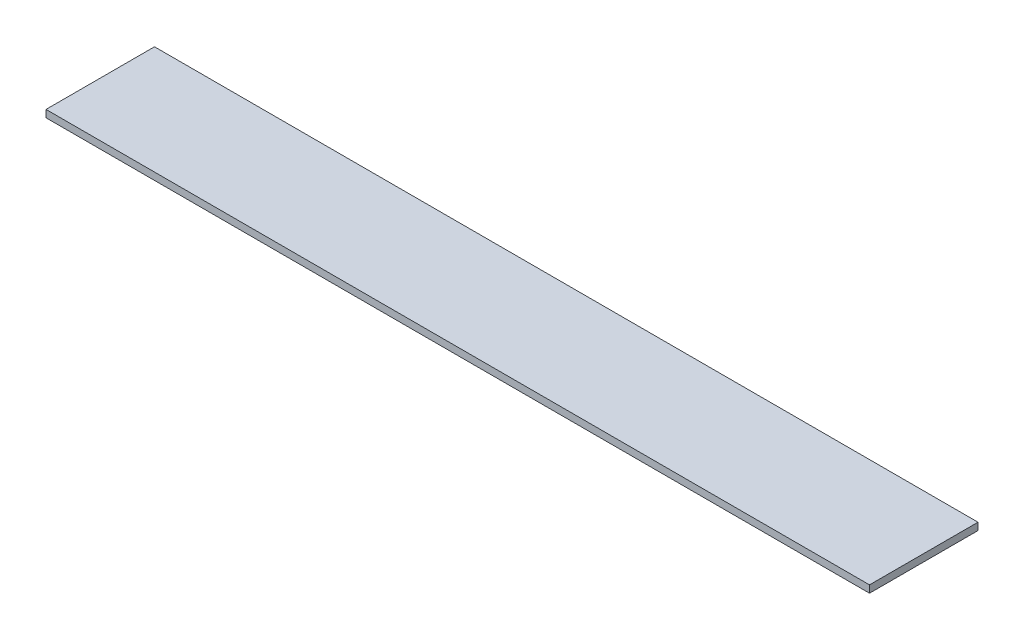
ISO-10303-21;
HEADER;
FILE_DESCRIPTION(('STEP AP214'),'2;1');
FILE_NAME('part.step','',(''),(''),'','','');
FILE_SCHEMA(('AUTOMOTIVE_DESIGN { 1 0 10303 214 1 1 1 1 }'));
ENDSEC;
DATA;
#1=APPLICATION_CONTEXT('core data for automotive mechanical design processes');
#2=APPLICATION_PROTOCOL_DEFINITION('international standard','automotive_design',2000,#1);
#3=PRODUCT_CONTEXT('',#1,'mechanical');
#4=PRODUCT('Part','Part','',(#3));
#5=PRODUCT_RELATED_PRODUCT_CATEGORY('part','',(#4));
#6=PRODUCT_DEFINITION_FORMATION('','',#4);
#7=PRODUCT_DEFINITION_CONTEXT('part definition',#1,'design');
#8=PRODUCT_DEFINITION('design','',#6,#7);
#9=PRODUCT_DEFINITION_SHAPE('','',#8);
#10=(LENGTH_UNIT() NAMED_UNIT(*) SI_UNIT(.MILLI.,.METRE.));
#11=(NAMED_UNIT(*) PLANE_ANGLE_UNIT() SI_UNIT($,.RADIAN.));
#12=(NAMED_UNIT(*) SI_UNIT($,.STERADIAN.) SOLID_ANGLE_UNIT());
#13=UNCERTAINTY_MEASURE_WITH_UNIT(LENGTH_MEASURE(1.E-05),#10,'distance_accuracy_value','');
#14=(GEOMETRIC_REPRESENTATION_CONTEXT(3) GLOBAL_UNCERTAINTY_ASSIGNED_CONTEXT((#13)) GLOBAL_UNIT_ASSIGNED_CONTEXT((#10,
#11,#12)) REPRESENTATION_CONTEXT('',''));
#15=CARTESIAN_POINT('',(0.,0.,0.));
#16=DIRECTION('',(0.,0.,1.));
#17=DIRECTION('',(1.,0.,0.));
#18=AXIS2_PLACEMENT_3D('',#15,#16,#17);
#19=CARTESIAN_POINT('',(0.,4.7625,0.));
#20=DIRECTION('',(1.,0.,0.));
#21=DIRECTION('',(0.,0.,-1.));
#22=AXIS2_PLACEMENT_3D('',#19,#20,#21);
#23=PLANE('',#22);
#24=DIRECTION('',(0.,0.,1.));
#25=VECTOR('',#24,1.);
#26=CARTESIAN_POINT('',(0.,0.,0.));
#27=LINE('',#26,#25);
#28=CARTESIAN_POINT('',(0.,0.,-71.12));
#29=VERTEX_POINT('',#28);
#30=CARTESIAN_POINT('',(0.,0.,0.));
#31=VERTEX_POINT('',#30);
#32=EDGE_CURVE('E98',#29,#31,#27,.T.);
#33=ORIENTED_EDGE('',*,*,#32,.T.);
#34=DIRECTION('',(0.,-1.,0.));
#35=VECTOR('',#34,1.);
#36=CARTESIAN_POINT('',(0.,4.7625,0.));
#37=LINE('',#36,#35);
#38=CARTESIAN_POINT('',(0.,4.7625,0.));
#39=VERTEX_POINT('',#38);
#40=EDGE_CURVE('E11',#39,#31,#37,.T.);
#41=ORIENTED_EDGE('',*,*,#40,.F.);
#42=DIRECTION('',(0.,0.,1.));
#43=VECTOR('',#42,1.);
#44=CARTESIAN_POINT('',(0.,4.7625,0.));
#45=LINE('',#44,#43);
#46=CARTESIAN_POINT('',(0.,4.7625,-71.12));
#47=VERTEX_POINT('',#46);
#48=EDGE_CURVE('E86',#47,#39,#45,.T.);
#49=ORIENTED_EDGE('',*,*,#48,.F.);
#50=DIRECTION('',(0.,-1.,0.));
#51=VECTOR('',#50,1.);
#52=CARTESIAN_POINT('',(0.,4.7625,-71.12));
#53=LINE('',#52,#51);
#54=EDGE_CURVE('E94',#47,#29,#53,.T.);
#55=ORIENTED_EDGE('',*,*,#54,.T.);
#56=EDGE_LOOP('',(#33,#41,#49,#55));
#57=FACE_BOUND('',#56,.T.);
#58=ADVANCED_FACE('F35',(#57),#23,.F.);
#59=CARTESIAN_POINT('',(0.,4.7625,0.));
#60=DIRECTION('',(0.,0.,-1.));
#61=DIRECTION('',(-1.,0.,0.));
#62=AXIS2_PLACEMENT_3D('',#59,#60,#61);
#63=PLANE('',#62);
#64=DIRECTION('',(1.,0.,0.));
#65=VECTOR('',#64,1.);
#66=CARTESIAN_POINT('',(0.,0.,0.));
#67=LINE('',#66,#65);
#68=CARTESIAN_POINT('',(539.75,0.,0.));
#69=VERTEX_POINT('',#68);
#70=EDGE_CURVE('E90',#31,#69,#67,.T.);
#71=ORIENTED_EDGE('',*,*,#70,.T.);
#72=DIRECTION('',(0.,-1.,0.));
#73=VECTOR('',#72,1.);
#74=CARTESIAN_POINT('',(539.75,4.7625,0.));
#75=LINE('',#74,#73);
#76=CARTESIAN_POINT('',(539.75,4.7625,0.));
#77=VERTEX_POINT('',#76);
#78=EDGE_CURVE('E43',#77,#69,#75,.T.);
#79=ORIENTED_EDGE('',*,*,#78,.F.);
#80=DIRECTION('',(1.,0.,0.));
#81=VECTOR('',#80,1.);
#82=CARTESIAN_POINT('',(0.,4.7625,0.));
#83=LINE('',#82,#81);
#84=EDGE_CURVE('E81',#39,#77,#83,.T.);
#85=ORIENTED_EDGE('',*,*,#84,.F.);
#86=ORIENTED_EDGE('',*,*,#40,.T.);
#87=EDGE_LOOP('',(#71,#79,#85,#86));
#88=FACE_BOUND('',#87,.T.);
#89=ADVANCED_FACE('F89',(#88),#63,.F.);
#90=CARTESIAN_POINT('',(539.75,4.7625,0.));
#91=DIRECTION('',(-1.,0.,0.));
#92=DIRECTION('',(0.,0.,1.));
#93=AXIS2_PLACEMENT_3D('',#90,#91,#92);
#94=PLANE('',#93);
#95=DIRECTION('',(0.,0.,-1.));
#96=VECTOR('',#95,1.);
#97=CARTESIAN_POINT('',(539.75,0.,0.));
#98=LINE('',#97,#96);
#99=CARTESIAN_POINT('',(539.75,0.,-71.12));
#100=VERTEX_POINT('',#99);
#101=EDGE_CURVE('E68',#69,#100,#98,.T.);
#102=ORIENTED_EDGE('',*,*,#101,.T.);
#103=DIRECTION('',(0.,-1.,0.));
#104=VECTOR('',#103,1.);
#105=CARTESIAN_POINT('',(539.75,4.7625,-71.12));
#106=LINE('',#105,#104);
#107=CARTESIAN_POINT('',(539.75,4.7625,-71.12));
#108=VERTEX_POINT('',#107);
#109=EDGE_CURVE('E91',#108,#100,#106,.T.);
#110=ORIENTED_EDGE('',*,*,#109,.F.);
#111=DIRECTION('',(0.,0.,-1.));
#112=VECTOR('',#111,1.);
#113=CARTESIAN_POINT('',(539.75,4.7625,0.));
#114=LINE('',#113,#112);
#115=EDGE_CURVE('E84',#77,#108,#114,.T.);
#116=ORIENTED_EDGE('',*,*,#115,.F.);
#117=ORIENTED_EDGE('',*,*,#78,.T.);
#118=EDGE_LOOP('',(#102,#110,#116,#117));
#119=FACE_BOUND('',#118,.T.);
#120=ADVANCED_FACE('F92',(#119),#94,.F.);
#121=CARTESIAN_POINT('',(0.,4.7625,-71.12));
#122=DIRECTION('',(0.,0.,1.));
#123=DIRECTION('',(1.,0.,0.));
#124=AXIS2_PLACEMENT_3D('',#121,#122,#123);
#125=PLANE('',#124);
#126=DIRECTION('',(-1.,0.,0.));
#127=VECTOR('',#126,1.);
#128=CARTESIAN_POINT('',(0.,0.,-71.12));
#129=LINE('',#128,#127);
#130=EDGE_CURVE('E74',#100,#29,#129,.T.);
#131=ORIENTED_EDGE('',*,*,#130,.T.);
#132=ORIENTED_EDGE('',*,*,#54,.F.);
#133=DIRECTION('',(-1.,0.,0.));
#134=VECTOR('',#133,1.);
#135=CARTESIAN_POINT('',(0.,4.7625,-71.12));
#136=LINE('',#135,#134);
#137=EDGE_CURVE('E51',#108,#47,#136,.T.);
#138=ORIENTED_EDGE('',*,*,#137,.F.);
#139=ORIENTED_EDGE('',*,*,#109,.T.);
#140=EDGE_LOOP('',(#131,#132,#138,#139));
#141=FACE_BOUND('',#140,.T.);
#142=ADVANCED_FACE('F105',(#141),#125,.F.);
#143=CARTESIAN_POINT('',(0.,4.7625,0.));
#144=DIRECTION('',(0.,-1.,0.));
#145=DIRECTION('',(0.,0.,-1.));
#146=AXIS2_PLACEMENT_3D('',#143,#144,#145);
#147=PLANE('',#146);
#148=ORIENTED_EDGE('',*,*,#48,.T.);
#149=ORIENTED_EDGE('',*,*,#84,.T.);
#150=ORIENTED_EDGE('',*,*,#115,.T.);
#151=ORIENTED_EDGE('',*,*,#137,.T.);
#152=EDGE_LOOP('',(#148,#149,#150,#151));
#153=FACE_BOUND('',#152,.T.);
#154=ADVANCED_FACE('F82',(#153),#147,.F.);
#155=CARTESIAN_POINT('',(0.,0.,0.));
#156=DIRECTION('',(0.,-1.,0.));
#157=DIRECTION('',(0.,0.,-1.));
#158=AXIS2_PLACEMENT_3D('',#155,#156,#157);
#159=PLANE('',#158);
#160=ORIENTED_EDGE('',*,*,#32,.F.);
#161=ORIENTED_EDGE('',*,*,#130,.F.);
#162=ORIENTED_EDGE('',*,*,#101,.F.);
#163=ORIENTED_EDGE('',*,*,#70,.F.);
#164=EDGE_LOOP('',(#160,#161,#162,#163));
#165=FACE_BOUND('',#164,.T.);
#166=ADVANCED_FACE('F108',(#165),#159,.T.);
#167=CLOSED_SHELL('',(#58,#89,#120,#142,#154,#166));
#168=MANIFOLD_SOLID_BREP('B2',#167);
#169=ADVANCED_BREP_SHAPE_REPRESENTATION('',(#18,#168),#14);
#170=SHAPE_DEFINITION_REPRESENTATION(#9,#169);
ENDSEC;
END-ISO-10303-21;
